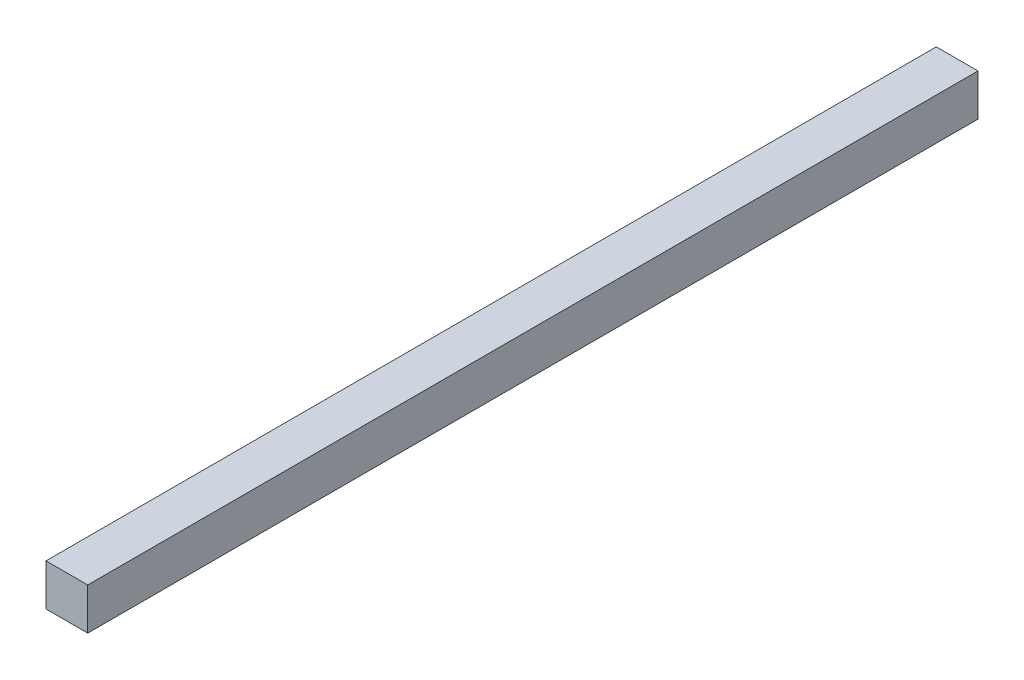
ISO-10303-21;
HEADER;
FILE_DESCRIPTION(('STEP AP214'),'2;1');
FILE_NAME('part.step','',(''),(''),'','','');
FILE_SCHEMA(('AUTOMOTIVE_DESIGN { 1 0 10303 214 1 1 1 1 }'));
ENDSEC;
DATA;
#1=APPLICATION_CONTEXT('core data for automotive mechanical design processes');
#2=APPLICATION_PROTOCOL_DEFINITION('international standard','automotive_design',2000,#1);
#3=PRODUCT_CONTEXT('',#1,'mechanical');
#4=PRODUCT('Part','Part','',(#3));
#5=PRODUCT_RELATED_PRODUCT_CATEGORY('part','',(#4));
#6=PRODUCT_DEFINITION_FORMATION('','',#4);
#7=PRODUCT_DEFINITION_CONTEXT('part definition',#1,'design');
#8=PRODUCT_DEFINITION('design','',#6,#7);
#9=PRODUCT_DEFINITION_SHAPE('','',#8);
#10=(LENGTH_UNIT() NAMED_UNIT(*) SI_UNIT(.MILLI.,.METRE.));
#11=(NAMED_UNIT(*) PLANE_ANGLE_UNIT() SI_UNIT($,.RADIAN.));
#12=(NAMED_UNIT(*) SI_UNIT($,.STERADIAN.) SOLID_ANGLE_UNIT());
#13=UNCERTAINTY_MEASURE_WITH_UNIT(LENGTH_MEASURE(1.E-05),#10,'distance_accuracy_value','');
#14=(GEOMETRIC_REPRESENTATION_CONTEXT(3) GLOBAL_UNCERTAINTY_ASSIGNED_CONTEXT((#13)) GLOBAL_UNIT_ASSIGNED_CONTEXT((#10,
#11,#12)) REPRESENTATION_CONTEXT('',''));
#15=CARTESIAN_POINT('',(0.,0.,0.));
#16=DIRECTION('',(0.,0.,1.));
#17=DIRECTION('',(1.,0.,0.));
#18=AXIS2_PLACEMENT_3D('',#15,#16,#17);
#19=CARTESIAN_POINT('',(-19.05,711.2,812.8));
#20=DIRECTION('',(1.,0.,0.));
#21=DIRECTION('',(0.,1.,0.));
#22=AXIS2_PLACEMENT_3D('',#19,#20,#21);
#23=PLANE('',#22);
#24=DIRECTION('',(0.,-1.,0.));
#25=VECTOR('',#24,1.);
#26=CARTESIAN_POINT('',(-19.05,711.2,0.));
#27=LINE('',#26,#25);
#28=CARTESIAN_POINT('',(-19.05,711.2,0.));
#29=VERTEX_POINT('',#28);
#30=CARTESIAN_POINT('',(-19.05,673.1,0.));
#31=VERTEX_POINT('',#30);
#32=EDGE_CURVE('E102',#29,#31,#27,.T.);
#33=ORIENTED_EDGE('',*,*,#32,.T.);
#34=DIRECTION('',(0.,0.,-1.));
#35=VECTOR('',#34,1.);
#36=CARTESIAN_POINT('',(-19.05,673.1,812.8));
#37=LINE('',#36,#35);
#38=CARTESIAN_POINT('',(-19.05,673.1,812.8));
#39=VERTEX_POINT('',#38);
#40=EDGE_CURVE('E11',#39,#31,#37,.T.);
#41=ORIENTED_EDGE('',*,*,#40,.F.);
#42=DIRECTION('',(0.,-1.,0.));
#43=VECTOR('',#42,1.);
#44=CARTESIAN_POINT('',(-19.05,711.2,812.8));
#45=LINE('',#44,#43);
#46=CARTESIAN_POINT('',(-19.05,711.2,812.8));
#47=VERTEX_POINT('',#46);
#48=EDGE_CURVE('E90',#47,#39,#45,.T.);
#49=ORIENTED_EDGE('',*,*,#48,.F.);
#50=DIRECTION('',(0.,0.,-1.));
#51=VECTOR('',#50,1.);
#52=CARTESIAN_POINT('',(-19.05,711.2,812.8));
#53=LINE('',#52,#51);
#54=EDGE_CURVE('E98',#47,#29,#53,.T.);
#55=ORIENTED_EDGE('',*,*,#54,.T.);
#56=EDGE_LOOP('',(#33,#41,#49,#55));
#57=FACE_BOUND('',#56,.T.);
#58=ADVANCED_FACE('F39',(#57),#23,.F.);
#59=CARTESIAN_POINT('',(-19.05,673.1,812.8));
#60=DIRECTION('',(0.,1.,0.));
#61=DIRECTION('',(0.,0.,1.));
#62=AXIS2_PLACEMENT_3D('',#59,#60,#61);
#63=PLANE('',#62);
#64=DIRECTION('',(1.,0.,0.));
#65=VECTOR('',#64,1.);
#66=CARTESIAN_POINT('',(-19.05,673.1,0.));
#67=LINE('',#66,#65);
#68=CARTESIAN_POINT('',(19.05,673.1,0.));
#69=VERTEX_POINT('',#68);
#70=EDGE_CURVE('E94',#31,#69,#67,.T.);
#71=ORIENTED_EDGE('',*,*,#70,.T.);
#72=DIRECTION('',(0.,0.,-1.));
#73=VECTOR('',#72,1.);
#74=CARTESIAN_POINT('',(19.05,673.1,812.8));
#75=LINE('',#74,#73);
#76=CARTESIAN_POINT('',(19.05,673.1,812.8));
#77=VERTEX_POINT('',#76);
#78=EDGE_CURVE('E47',#77,#69,#75,.T.);
#79=ORIENTED_EDGE('',*,*,#78,.F.);
#80=DIRECTION('',(1.,0.,0.));
#81=VECTOR('',#80,1.);
#82=CARTESIAN_POINT('',(-19.05,673.1,812.8));
#83=LINE('',#82,#81);
#84=EDGE_CURVE('E85',#39,#77,#83,.T.);
#85=ORIENTED_EDGE('',*,*,#84,.F.);
#86=ORIENTED_EDGE('',*,*,#40,.T.);
#87=EDGE_LOOP('',(#71,#79,#85,#86));
#88=FACE_BOUND('',#87,.T.);
#89=ADVANCED_FACE('F93',(#88),#63,.F.);
#90=CARTESIAN_POINT('',(19.05,711.2,812.8));
#91=DIRECTION('',(-1.,0.,0.));
#92=DIRECTION('',(0.,-1.,0.));
#93=AXIS2_PLACEMENT_3D('',#90,#91,#92);
#94=PLANE('',#93);
#95=DIRECTION('',(0.,1.,0.));
#96=VECTOR('',#95,1.);
#97=CARTESIAN_POINT('',(19.05,711.2,0.));
#98=LINE('',#97,#96);
#99=CARTESIAN_POINT('',(19.05,711.2,0.));
#100=VERTEX_POINT('',#99);
#101=EDGE_CURVE('E72',#69,#100,#98,.T.);
#102=ORIENTED_EDGE('',*,*,#101,.T.);
#103=DIRECTION('',(0.,0.,-1.));
#104=VECTOR('',#103,1.);
#105=CARTESIAN_POINT('',(19.05,711.2,812.8));
#106=LINE('',#105,#104);
#107=CARTESIAN_POINT('',(19.05,711.2,812.8));
#108=VERTEX_POINT('',#107);
#109=EDGE_CURVE('E95',#108,#100,#106,.T.);
#110=ORIENTED_EDGE('',*,*,#109,.F.);
#111=DIRECTION('',(0.,1.,0.));
#112=VECTOR('',#111,1.);
#113=CARTESIAN_POINT('',(19.05,711.2,812.8));
#114=LINE('',#113,#112);
#115=EDGE_CURVE('E88',#77,#108,#114,.T.);
#116=ORIENTED_EDGE('',*,*,#115,.F.);
#117=ORIENTED_EDGE('',*,*,#78,.T.);
#118=EDGE_LOOP('',(#102,#110,#116,#117));
#119=FACE_BOUND('',#118,.T.);
#120=ADVANCED_FACE('F96',(#119),#94,.F.);
#121=CARTESIAN_POINT('',(-19.05,711.2,812.8));
#122=DIRECTION('',(0.,-1.,0.));
#123=DIRECTION('',(0.,0.,-1.));
#124=AXIS2_PLACEMENT_3D('',#121,#122,#123);
#125=PLANE('',#124);
#126=DIRECTION('',(-1.,0.,0.));
#127=VECTOR('',#126,1.);
#128=CARTESIAN_POINT('',(-19.05,711.2,0.));
#129=LINE('',#128,#127);
#130=EDGE_CURVE('E78',#100,#29,#129,.T.);
#131=ORIENTED_EDGE('',*,*,#130,.T.);
#132=ORIENTED_EDGE('',*,*,#54,.F.);
#133=DIRECTION('',(-1.,0.,0.));
#134=VECTOR('',#133,1.);
#135=CARTESIAN_POINT('',(-19.05,711.2,812.8));
#136=LINE('',#135,#134);
#137=EDGE_CURVE('E55',#108,#47,#136,.T.);
#138=ORIENTED_EDGE('',*,*,#137,.F.);
#139=ORIENTED_EDGE('',*,*,#109,.T.);
#140=EDGE_LOOP('',(#131,#132,#138,#139));
#141=FACE_BOUND('',#140,.T.);
#142=ADVANCED_FACE('F109',(#141),#125,.F.);
#143=CARTESIAN_POINT('',(0.,0.,812.8));
#144=DIRECTION('',(0.,0.,1.));
#145=DIRECTION('',(1.,0.,0.));
#146=AXIS2_PLACEMENT_3D('',#143,#144,#145);
#147=PLANE('',#146);
#148=ORIENTED_EDGE('',*,*,#48,.T.);
#149=ORIENTED_EDGE('',*,*,#84,.T.);
#150=ORIENTED_EDGE('',*,*,#115,.T.);
#151=ORIENTED_EDGE('',*,*,#137,.T.);
#152=EDGE_LOOP('',(#148,#149,#150,#151));
#153=FACE_BOUND('',#152,.T.);
#154=ADVANCED_FACE('F86',(#153),#147,.T.);
#155=CARTESIAN_POINT('',(0.,0.,0.));
#156=DIRECTION('',(0.,0.,1.));
#157=DIRECTION('',(1.,0.,0.));
#158=AXIS2_PLACEMENT_3D('',#155,#156,#157);
#159=PLANE('',#158);
#160=ORIENTED_EDGE('',*,*,#32,.F.);
#161=ORIENTED_EDGE('',*,*,#130,.F.);
#162=ORIENTED_EDGE('',*,*,#101,.F.);
#163=ORIENTED_EDGE('',*,*,#70,.F.);
#164=EDGE_LOOP('',(#160,#161,#162,#163));
#165=FACE_BOUND('',#164,.T.);
#166=ADVANCED_FACE('F112',(#165),#159,.F.);
#167=CLOSED_SHELL('',(#58,#89,#120,#142,#154,#166));
#168=MANIFOLD_SOLID_BREP('B2',#167);
#169=ADVANCED_BREP_SHAPE_REPRESENTATION('',(#18,#168),#14);
#170=SHAPE_DEFINITION_REPRESENTATION(#9,#169);
ENDSEC;
END-ISO-10303-21;
